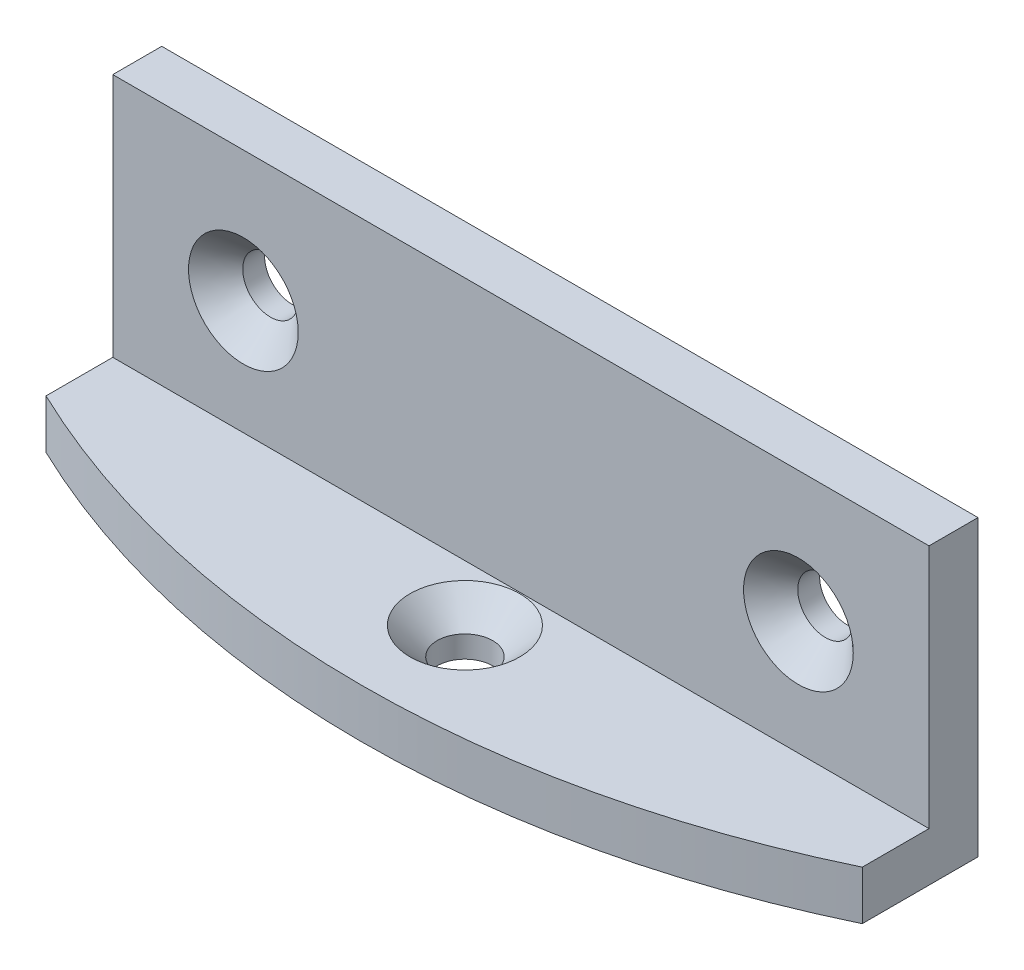
ISO-10303-21;
HEADER;
FILE_DESCRIPTION(('STEP AP214'),'2;1');
FILE_NAME('part.step','',(''),(''),'','','');
FILE_SCHEMA(('AUTOMOTIVE_DESIGN { 1 0 10303 214 1 1 1 1 }'));
ENDSEC;
DATA;
#1=APPLICATION_CONTEXT('core data for automotive mechanical design processes');
#2=APPLICATION_PROTOCOL_DEFINITION('international standard','automotive_design',2000,#1);
#3=PRODUCT_CONTEXT('',#1,'mechanical');
#4=PRODUCT('Part','Part','',(#3));
#5=PRODUCT_RELATED_PRODUCT_CATEGORY('part','',(#4));
#6=PRODUCT_DEFINITION_FORMATION('','',#4);
#7=PRODUCT_DEFINITION_CONTEXT('part definition',#1,'design');
#8=PRODUCT_DEFINITION('design','',#6,#7);
#9=PRODUCT_DEFINITION_SHAPE('','',#8);
#10=(LENGTH_UNIT() NAMED_UNIT(*) SI_UNIT(.MILLI.,.METRE.));
#11=(NAMED_UNIT(*) PLANE_ANGLE_UNIT() SI_UNIT($,.RADIAN.));
#12=(NAMED_UNIT(*) SI_UNIT($,.STERADIAN.) SOLID_ANGLE_UNIT());
#13=UNCERTAINTY_MEASURE_WITH_UNIT(LENGTH_MEASURE(1.E-05),#10,'distance_accuracy_value','');
#14=(GEOMETRIC_REPRESENTATION_CONTEXT(3) GLOBAL_UNCERTAINTY_ASSIGNED_CONTEXT((#13)) GLOBAL_UNIT_ASSIGNED_CONTEXT((#10,
#11,#12)) REPRESENTATION_CONTEXT('',''));
#15=CARTESIAN_POINT('',(0.,0.,0.));
#16=DIRECTION('',(0.,0.,1.));
#17=DIRECTION('',(1.,0.,0.));
#18=AXIS2_PLACEMENT_3D('',#15,#16,#17);
#19=CARTESIAN_POINT('',(-25.,15.,3.));
#20=DIRECTION('',(0.,0.,-1.));
#21=DIRECTION('',(-1.,0.,0.));
#22=AXIS2_PLACEMENT_3D('',#19,#20,#21);
#23=PLANE('',#22);
#24=DIRECTION('',(1.,0.,0.));
#25=VECTOR('',#24,1.);
#26=CARTESIAN_POINT('',(-25.,0.,3.));
#27=LINE('',#26,#25);
#28=CARTESIAN_POINT('',(-25.,0.,3.));
#29=VERTEX_POINT('',#28);
#30=CARTESIAN_POINT('',(25.,0.,3.));
#31=VERTEX_POINT('',#30);
#32=EDGE_CURVE('E57',#29,#31,#27,.T.);
#33=ORIENTED_EDGE('',*,*,#32,.T.);
#34=DIRECTION('',(0.,-1.,0.));
#35=VECTOR('',#34,1.);
#36=CARTESIAN_POINT('',(25.,15.,3.));
#37=LINE('',#36,#35);
#38=CARTESIAN_POINT('',(25.,15.,3.));
#39=VERTEX_POINT('',#38);
#40=EDGE_CURVE('E108',#39,#31,#37,.T.);
#41=ORIENTED_EDGE('',*,*,#40,.F.);
#42=DIRECTION('',(1.,0.,0.));
#43=VECTOR('',#42,1.);
#44=CARTESIAN_POINT('',(-25.,15.,3.));
#45=LINE('',#44,#43);
#46=CARTESIAN_POINT('',(-25.,15.,3.));
#47=VERTEX_POINT('',#46);
#48=EDGE_CURVE('E101',#47,#39,#45,.T.);
#49=ORIENTED_EDGE('',*,*,#48,.F.);
#50=DIRECTION('',(0.,-1.,0.));
#51=VECTOR('',#50,1.);
#52=CARTESIAN_POINT('',(-25.,15.,3.));
#53=LINE('',#52,#51);
#54=EDGE_CURVE('E110',#47,#29,#53,.T.);
#55=ORIENTED_EDGE('',*,*,#54,.T.);
#56=EDGE_LOOP('',(#33,#41,#49,#55));
#57=FACE_BOUND('',#56,.T.);
#58=CARTESIAN_POINT('',(17.,7.00000000000006,3.));
#59=DIRECTION('',(0.,0.,1.));
#60=DIRECTION('',(1.,0.,0.));
#61=AXIS2_PLACEMENT_3D('',#58,#59,#60);
#62=CIRCLE('',#61,3.36);
#63=CARTESIAN_POINT('',(20.36,7.00000000000006,3.));
#64=VERTEX_POINT('',#63);
#65=EDGE_CURVE('E161',#64,#64,#62,.T.);
#66=ORIENTED_EDGE('',*,*,#65,.F.);
#67=EDGE_LOOP('',(#66));
#68=FACE_BOUND('',#67,.T.);
#69=CARTESIAN_POINT('',(-17.,7.00000000000006,3.));
#70=DIRECTION('',(0.,0.,1.));
#71=DIRECTION('',(1.,0.,0.));
#72=AXIS2_PLACEMENT_3D('',#69,#70,#71);
#73=CIRCLE('',#72,3.36);
#74=CARTESIAN_POINT('',(-13.64,7.00000000000006,3.));
#75=VERTEX_POINT('',#74);
#76=EDGE_CURVE('E175',#75,#75,#73,.T.);
#77=ORIENTED_EDGE('',*,*,#76,.F.);
#78=EDGE_LOOP('',(#77));
#79=FACE_BOUND('',#78,.T.);
#80=ADVANCED_FACE('F39',(#57,#68,#79),#23,.F.);
#81=CARTESIAN_POINT('',(-25.,-3.,0.));
#82=DIRECTION('',(-1.,0.,0.));
#83=DIRECTION('',(0.,0.,1.));
#84=AXIS2_PLACEMENT_3D('',#81,#82,#83);
#85=PLANE('',#84);
#86=DIRECTION('',(0.,0.,1.));
#87=VECTOR('',#86,1.);
#88=CARTESIAN_POINT('',(-25.,0.,0.));
#89=LINE('',#88,#87);
#90=CARTESIAN_POINT('',(-25.,0.,7.09007412973749));
#91=VERTEX_POINT('',#90);
#92=EDGE_CURVE('E119',#29,#91,#89,.T.);
#93=ORIENTED_EDGE('',*,*,#92,.F.);
#94=ORIENTED_EDGE('',*,*,#54,.F.);
#95=DIRECTION('',(0.,0.,1.));
#96=VECTOR('',#95,1.);
#97=CARTESIAN_POINT('',(-25.,15.,0.));
#98=LINE('',#97,#96);
#99=CARTESIAN_POINT('',(-25.,15.,0.));
#100=VERTEX_POINT('',#99);
#101=EDGE_CURVE('E113',#100,#47,#98,.T.);
#102=ORIENTED_EDGE('',*,*,#101,.F.);
#103=DIRECTION('',(0.,1.,0.));
#104=VECTOR('',#103,1.);
#105=CARTESIAN_POINT('',(-25.,-3.,0.));
#106=LINE('',#105,#104);
#107=CARTESIAN_POINT('',(-25.,-3.,0.));
#108=VERTEX_POINT('',#107);
#109=EDGE_CURVE('E11',#108,#100,#106,.T.);
#110=ORIENTED_EDGE('',*,*,#109,.F.);
#111=DIRECTION('',(0.,0.,1.));
#112=VECTOR('',#111,1.);
#113=CARTESIAN_POINT('',(-25.,-3.,0.));
#114=LINE('',#113,#112);
#115=CARTESIAN_POINT('',(-25.,-3.,7.09007412973749));
#116=VERTEX_POINT('',#115);
#117=EDGE_CURVE('E130',#108,#116,#114,.T.);
#118=ORIENTED_EDGE('',*,*,#117,.T.);
#119=DIRECTION('',(0.,1.,0.));
#120=VECTOR('',#119,1.);
#121=CARTESIAN_POINT('',(-25.,-3.,7.09007412973749));
#122=LINE('',#121,#120);
#123=EDGE_CURVE('E43',#116,#91,#122,.T.);
#124=ORIENTED_EDGE('',*,*,#123,.T.);
#125=EDGE_LOOP('',(#93,#94,#102,#110,#118,#124));
#126=FACE_BOUND('',#125,.T.);
#127=ADVANCED_FACE('F41',(#126),#85,.T.);
#128=CARTESIAN_POINT('',(-25.,-3.,0.));
#129=DIRECTION('',(0.,0.,1.));
#130=DIRECTION('',(1.,0.,0.));
#131=AXIS2_PLACEMENT_3D('',#128,#129,#130);
#132=PLANE('',#131);
#133=CARTESIAN_POINT('',(-17.,7.00000000000006,0.));
#134=DIRECTION('',(0.,0.,1.));
#135=DIRECTION('',(1.,0.,0.));
#136=AXIS2_PLACEMENT_3D('',#133,#134,#135);
#137=CIRCLE('',#136,1.69999999999999);
#138=CARTESIAN_POINT('',(-15.3,7.00000000000006,0.));
#139=VERTEX_POINT('',#138);
#140=EDGE_CURVE('E168',#139,#139,#137,.T.);
#141=ORIENTED_EDGE('',*,*,#140,.T.);
#142=EDGE_LOOP('',(#141));
#143=FACE_BOUND('',#142,.T.);
#144=CARTESIAN_POINT('',(17.,7.00000000000006,0.));
#145=DIRECTION('',(0.,0.,1.));
#146=DIRECTION('',(1.,0.,0.));
#147=AXIS2_PLACEMENT_3D('',#144,#145,#146);
#148=CIRCLE('',#147,1.69999999999999);
#149=CARTESIAN_POINT('',(18.7,7.00000000000006,0.));
#150=VERTEX_POINT('',#149);
#151=EDGE_CURVE('E160',#150,#150,#148,.T.);
#152=ORIENTED_EDGE('',*,*,#151,.T.);
#153=EDGE_LOOP('',(#152));
#154=FACE_BOUND('',#153,.T.);
#155=ORIENTED_EDGE('',*,*,#109,.T.);
#156=DIRECTION('',(-1.,0.,0.));
#157=VECTOR('',#156,1.);
#158=CARTESIAN_POINT('',(-25.,15.,0.));
#159=LINE('',#158,#157);
#160=CARTESIAN_POINT('',(25.,15.,0.));
#161=VERTEX_POINT('',#160);
#162=EDGE_CURVE('E117',#161,#100,#159,.T.);
#163=ORIENTED_EDGE('',*,*,#162,.F.);
#164=DIRECTION('',(0.,1.,0.));
#165=VECTOR('',#164,1.);
#166=CARTESIAN_POINT('',(25.,-3.,0.));
#167=LINE('',#166,#165);
#168=CARTESIAN_POINT('',(25.,-3.,0.));
#169=VERTEX_POINT('',#168);
#170=EDGE_CURVE('E48',#169,#161,#167,.T.);
#171=ORIENTED_EDGE('',*,*,#170,.F.);
#172=DIRECTION('',(1.,0.,0.));
#173=VECTOR('',#172,1.);
#174=CARTESIAN_POINT('',(-25.,-3.,0.));
#175=LINE('',#174,#173);
#176=EDGE_CURVE('E135',#108,#169,#175,.T.);
#177=ORIENTED_EDGE('',*,*,#176,.F.);
#178=EDGE_LOOP('',(#155,#163,#171,#177));
#179=FACE_BOUND('',#178,.T.);
#180=ADVANCED_FACE('F184',(#143,#154,#179),#132,.F.);
#181=CARTESIAN_POINT('',(25.,-3.,0.));
#182=DIRECTION('',(-1.,0.,0.));
#183=DIRECTION('',(0.,0.,1.));
#184=AXIS2_PLACEMENT_3D('',#181,#182,#183);
#185=PLANE('',#184);
#186=ORIENTED_EDGE('',*,*,#170,.T.);
#187=DIRECTION('',(0.,0.,-1.));
#188=VECTOR('',#187,1.);
#189=CARTESIAN_POINT('',(25.,15.,0.));
#190=LINE('',#189,#188);
#191=EDGE_CURVE('E115',#39,#161,#190,.T.);
#192=ORIENTED_EDGE('',*,*,#191,.F.);
#193=ORIENTED_EDGE('',*,*,#40,.T.);
#194=DIRECTION('',(0.,0.,1.));
#195=VECTOR('',#194,1.);
#196=CARTESIAN_POINT('',(25.,0.,0.));
#197=LINE('',#196,#195);
#198=CARTESIAN_POINT('',(25.,0.,7.09007412973756));
#199=VERTEX_POINT('',#198);
#200=EDGE_CURVE('E76',#31,#199,#197,.T.);
#201=ORIENTED_EDGE('',*,*,#200,.T.);
#202=DIRECTION('',(0.,1.,0.));
#203=VECTOR('',#202,1.);
#204=CARTESIAN_POINT('',(25.,-3.,7.09007412973756));
#205=LINE('',#204,#203);
#206=CARTESIAN_POINT('',(25.,-3.,7.09007412973756));
#207=VERTEX_POINT('',#206);
#208=EDGE_CURVE('E137',#207,#199,#205,.T.);
#209=ORIENTED_EDGE('',*,*,#208,.F.);
#210=DIRECTION('',(0.,0.,1.));
#211=VECTOR('',#210,1.);
#212=CARTESIAN_POINT('',(25.,-3.,0.));
#213=LINE('',#212,#211);
#214=EDGE_CURVE('E134',#169,#207,#213,.T.);
#215=ORIENTED_EDGE('',*,*,#214,.F.);
#216=EDGE_LOOP('',(#186,#192,#193,#201,#209,#215));
#217=FACE_BOUND('',#216,.T.);
#218=ADVANCED_FACE('F141',(#217),#185,.F.);
#219=CARTESIAN_POINT('',(0.,-3.,-45.));
#220=DIRECTION('',(0.,1.,0.));
#221=DIRECTION('',(0.,0.,1.));
#222=AXIS2_PLACEMENT_3D('',#219,#220,#221);
#223=CYLINDRICAL_SURFACE('',#222,57.7786796564403);
#224=CARTESIAN_POINT('',(0.,0.,-45.));
#225=DIRECTION('',(0.,1.,0.));
#226=DIRECTION('',(0.,0.,1.));
#227=AXIS2_PLACEMENT_3D('',#224,#225,#226);
#228=CIRCLE('',#227,57.7786796564403);
#229=EDGE_CURVE('E125',#91,#199,#228,.T.);
#230=ORIENTED_EDGE('',*,*,#229,.F.);
#231=ORIENTED_EDGE('',*,*,#123,.F.);
#232=CARTESIAN_POINT('',(0.,-3.,-45.));
#233=DIRECTION('',(0.,1.,0.));
#234=DIRECTION('',(0.,0.,1.));
#235=AXIS2_PLACEMENT_3D('',#232,#233,#234);
#236=CIRCLE('',#235,57.7786796564403);
#237=EDGE_CURVE('E126',#116,#207,#236,.T.);
#238=ORIENTED_EDGE('',*,*,#237,.T.);
#239=ORIENTED_EDGE('',*,*,#208,.T.);
#240=EDGE_LOOP('',(#230,#231,#238,#239));
#241=FACE_BOUND('',#240,.T.);
#242=ADVANCED_FACE('F139',(#241),#223,.T.);
#243=CARTESIAN_POINT('',(0.,-3.,-45.));
#244=DIRECTION('',(0.,1.,0.));
#245=DIRECTION('',(0.,0.,1.));
#246=AXIS2_PLACEMENT_3D('',#243,#244,#245);
#247=PLANE('',#246);
#248=CARTESIAN_POINT('',(0.,-3.,6.42891630803637));
#249=DIRECTION('',(0.,1.,0.));
#250=DIRECTION('',(0.,0.,1.));
#251=AXIS2_PLACEMENT_3D('',#248,#249,#250);
#252=CIRCLE('',#251,1.7);
#253=CARTESIAN_POINT('',(0.,-3.,8.12891630803637));
#254=VERTEX_POINT('',#253);
#255=EDGE_CURVE('E145',#254,#254,#252,.T.);
#256=ORIENTED_EDGE('',*,*,#255,.T.);
#257=EDGE_LOOP('',(#256));
#258=FACE_BOUND('',#257,.T.);
#259=ORIENTED_EDGE('',*,*,#117,.F.);
#260=ORIENTED_EDGE('',*,*,#176,.T.);
#261=ORIENTED_EDGE('',*,*,#214,.T.);
#262=ORIENTED_EDGE('',*,*,#237,.F.);
#263=EDGE_LOOP('',(#259,#260,#261,#262));
#264=FACE_BOUND('',#263,.T.);
#265=ADVANCED_FACE('F186',(#258,#264),#247,.F.);
#266=CARTESIAN_POINT('',(0.,0.,-45.));
#267=DIRECTION('',(0.,1.,0.));
#268=DIRECTION('',(0.,0.,1.));
#269=AXIS2_PLACEMENT_3D('',#266,#267,#268);
#270=PLANE('',#269);
#271=CARTESIAN_POINT('',(0.,0.,6.42891630803637));
#272=DIRECTION('',(0.,1.,0.));
#273=DIRECTION('',(0.,0.,1.));
#274=AXIS2_PLACEMENT_3D('',#271,#272,#273);
#275=CIRCLE('',#274,3.36);
#276=CARTESIAN_POINT('',(0.,0.,9.78891630803637));
#277=VERTEX_POINT('',#276);
#278=EDGE_CURVE('E152',#277,#277,#275,.T.);
#279=ORIENTED_EDGE('',*,*,#278,.F.);
#280=EDGE_LOOP('',(#279));
#281=FACE_BOUND('',#280,.T.);
#282=ORIENTED_EDGE('',*,*,#32,.F.);
#283=ORIENTED_EDGE('',*,*,#92,.T.);
#284=ORIENTED_EDGE('',*,*,#229,.T.);
#285=ORIENTED_EDGE('',*,*,#200,.F.);
#286=EDGE_LOOP('',(#282,#283,#284,#285));
#287=FACE_BOUND('',#286,.T.);
#288=ADVANCED_FACE('F142',(#281,#287),#270,.T.);
#289=CARTESIAN_POINT('',(0.,15.,0.));
#290=DIRECTION('',(0.,1.,0.));
#291=DIRECTION('',(0.,0.,1.));
#292=AXIS2_PLACEMENT_3D('',#289,#290,#291);
#293=PLANE('',#292);
#294=ORIENTED_EDGE('',*,*,#101,.T.);
#295=ORIENTED_EDGE('',*,*,#48,.T.);
#296=ORIENTED_EDGE('',*,*,#191,.T.);
#297=ORIENTED_EDGE('',*,*,#162,.T.);
#298=EDGE_LOOP('',(#294,#295,#296,#297));
#299=FACE_BOUND('',#298,.T.);
#300=ADVANCED_FACE('F116',(#299),#293,.T.);
#301=CARTESIAN_POINT('',(0.,0.,6.42891630803637));
#302=DIRECTION('',(0.,1.,0.));
#303=DIRECTION('',(0.,0.,1.));
#304=AXIS2_PLACEMENT_3D('',#301,#302,#303);
#305=CYLINDRICAL_SURFACE('',#304,1.7);
#306=ORIENTED_EDGE('',*,*,#255,.F.);
#307=EDGE_LOOP('',(#306));
#308=FACE_BOUND('',#307,.T.);
#309=CARTESIAN_POINT('',(0.,-1.66,6.42891630803637));
#310=DIRECTION('',(0.,1.,0.));
#311=DIRECTION('',(0.,0.,1.));
#312=AXIS2_PLACEMENT_3D('',#309,#310,#311);
#313=CIRCLE('',#312,1.7);
#314=CARTESIAN_POINT('',(0.,-1.66,8.12891630803637));
#315=VERTEX_POINT('',#314);
#316=EDGE_CURVE('E151',#315,#315,#313,.T.);
#317=ORIENTED_EDGE('',*,*,#316,.T.);
#318=EDGE_LOOP('',(#317));
#319=FACE_BOUND('',#318,.T.);
#320=ADVANCED_FACE('F221',(#308,#319),#305,.F.);
#321=CARTESIAN_POINT('',(0.,0.,6.42891630803637));
#322=DIRECTION('',(0.,1.,0.));
#323=DIRECTION('',(0.,0.,1.));
#324=AXIS2_PLACEMENT_3D('',#321,#322,#323);
#325=CONICAL_SURFACE('',#324,3.36,0.785398163397448);
#326=ORIENTED_EDGE('',*,*,#316,.F.);
#327=EDGE_LOOP('',(#326));
#328=FACE_BOUND('',#327,.T.);
#329=ORIENTED_EDGE('',*,*,#278,.T.);
#330=EDGE_LOOP('',(#329));
#331=FACE_BOUND('',#330,.T.);
#332=ADVANCED_FACE('F236',(#328,#331),#325,.F.);
#333=CARTESIAN_POINT('',(17.,7.00000000000006,3.));
#334=DIRECTION('',(0.,0.,1.));
#335=DIRECTION('',(1.,0.,0.));
#336=AXIS2_PLACEMENT_3D('',#333,#334,#335);
#337=CYLINDRICAL_SURFACE('',#336,1.69999999999999);
#338=ORIENTED_EDGE('',*,*,#151,.F.);
#339=EDGE_LOOP('',(#338));
#340=FACE_BOUND('',#339,.T.);
#341=CARTESIAN_POINT('',(17.,7.00000000000006,1.33999999999998));
#342=DIRECTION('',(0.,0.,1.));
#343=DIRECTION('',(1.,0.,0.));
#344=AXIS2_PLACEMENT_3D('',#341,#342,#343);
#345=CIRCLE('',#344,1.69999999999999);
#346=CARTESIAN_POINT('',(18.7,7.00000000000006,1.33999999999998));
#347=VERTEX_POINT('',#346);
#348=EDGE_CURVE('E159',#347,#347,#345,.T.);
#349=ORIENTED_EDGE('',*,*,#348,.T.);
#350=EDGE_LOOP('',(#349));
#351=FACE_BOUND('',#350,.T.);
#352=ADVANCED_FACE('F243',(#340,#351),#337,.F.);
#353=CARTESIAN_POINT('',(17.,7.00000000000006,3.));
#354=DIRECTION('',(0.,0.,1.));
#355=DIRECTION('',(1.,0.,0.));
#356=AXIS2_PLACEMENT_3D('',#353,#354,#355);
#357=CONICAL_SURFACE('',#356,3.36,0.785398163397446);
#358=ORIENTED_EDGE('',*,*,#348,.F.);
#359=EDGE_LOOP('',(#358));
#360=FACE_BOUND('',#359,.T.);
#361=ORIENTED_EDGE('',*,*,#65,.T.);
#362=EDGE_LOOP('',(#361));
#363=FACE_BOUND('',#362,.T.);
#364=ADVANCED_FACE('F258',(#360,#363),#357,.F.);
#365=CARTESIAN_POINT('',(-17.,7.00000000000006,3.));
#366=DIRECTION('',(0.,0.,1.));
#367=DIRECTION('',(1.,0.,0.));
#368=AXIS2_PLACEMENT_3D('',#365,#366,#367);
#369=CYLINDRICAL_SURFACE('',#368,1.69999999999999);
#370=ORIENTED_EDGE('',*,*,#140,.F.);
#371=EDGE_LOOP('',(#370));
#372=FACE_BOUND('',#371,.T.);
#373=CARTESIAN_POINT('',(-17.,7.00000000000006,1.33999999999998));
#374=DIRECTION('',(0.,0.,1.));
#375=DIRECTION('',(1.,0.,0.));
#376=AXIS2_PLACEMENT_3D('',#373,#374,#375);
#377=CIRCLE('',#376,1.69999999999999);
#378=CARTESIAN_POINT('',(-15.3,7.00000000000006,1.33999999999998));
#379=VERTEX_POINT('',#378);
#380=EDGE_CURVE('E169',#379,#379,#377,.T.);
#381=ORIENTED_EDGE('',*,*,#380,.T.);
#382=EDGE_LOOP('',(#381));
#383=FACE_BOUND('',#382,.T.);
#384=ADVANCED_FACE('F269',(#372,#383),#369,.F.);
#385=CARTESIAN_POINT('',(-17.,7.00000000000006,3.));
#386=DIRECTION('',(0.,0.,1.));
#387=DIRECTION('',(1.,0.,0.));
#388=AXIS2_PLACEMENT_3D('',#385,#386,#387);
#389=CONICAL_SURFACE('',#388,3.36,0.785398163397445);
#390=ORIENTED_EDGE('',*,*,#380,.F.);
#391=EDGE_LOOP('',(#390));
#392=FACE_BOUND('',#391,.T.);
#393=ORIENTED_EDGE('',*,*,#76,.T.);
#394=EDGE_LOOP('',(#393));
#395=FACE_BOUND('',#394,.T.);
#396=ADVANCED_FACE('F176',(#392,#395),#389,.F.);
#397=CLOSED_SHELL('',(#80,#127,#180,#218,#242,#265,#288,#300,#320,#332,#352,#364,#384,#396));
#398=MANIFOLD_SOLID_BREP('B2',#397);
#399=ADVANCED_BREP_SHAPE_REPRESENTATION('',(#18,#398),#14);
#400=SHAPE_DEFINITION_REPRESENTATION(#9,#399);
ENDSEC;
END-ISO-10303-21;
